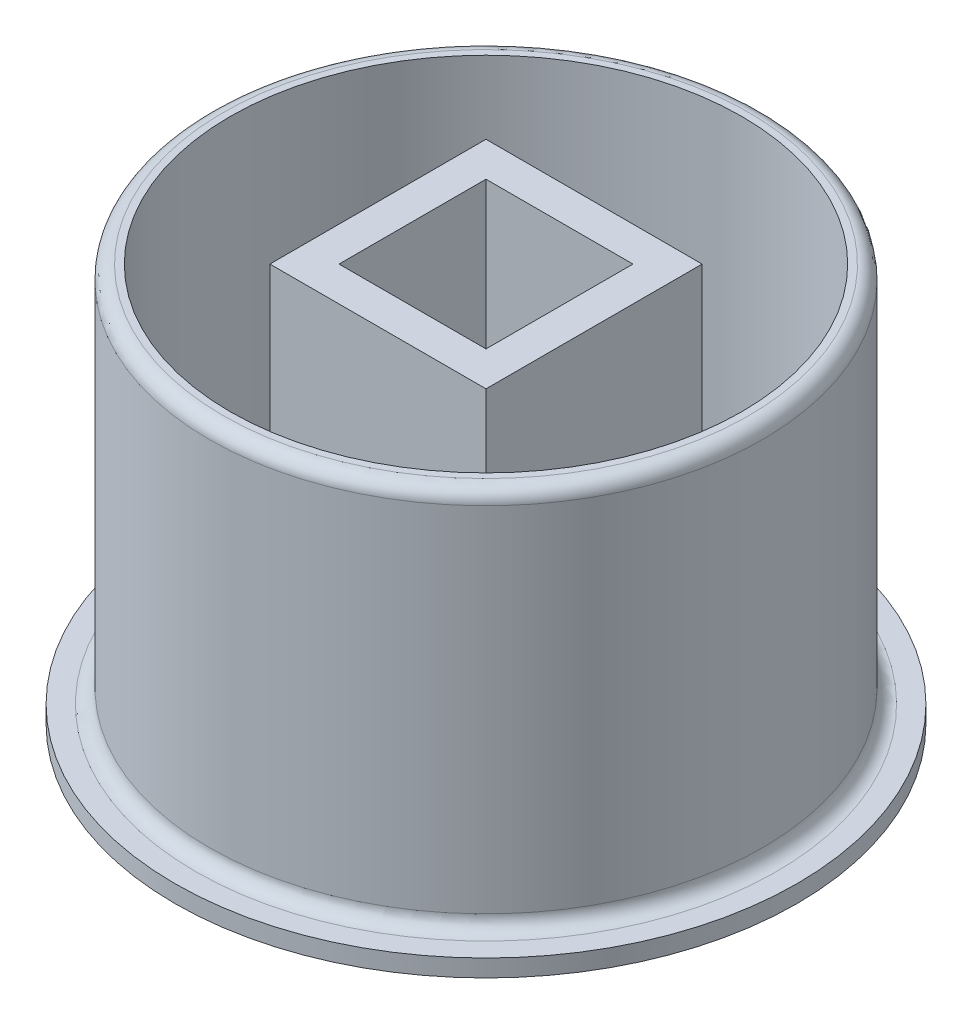
ISO-10303-21;
HEADER;
FILE_DESCRIPTION(('STEP AP214'),'2;1');
FILE_NAME('part.step','',(''),(''),'','','');
FILE_SCHEMA(('AUTOMOTIVE_DESIGN { 1 0 10303 214 1 1 1 1 }'));
ENDSEC;
DATA;
#1=APPLICATION_CONTEXT('core data for automotive mechanical design processes');
#2=APPLICATION_PROTOCOL_DEFINITION('international standard','automotive_design',2000,#1);
#3=PRODUCT_CONTEXT('',#1,'mechanical');
#4=PRODUCT('Part','Part','',(#3));
#5=PRODUCT_RELATED_PRODUCT_CATEGORY('part','',(#4));
#6=PRODUCT_DEFINITION_FORMATION('','',#4);
#7=PRODUCT_DEFINITION_CONTEXT('part definition',#1,'design');
#8=PRODUCT_DEFINITION('design','',#6,#7);
#9=PRODUCT_DEFINITION_SHAPE('','',#8);
#10=(LENGTH_UNIT() NAMED_UNIT(*) SI_UNIT(.MILLI.,.METRE.));
#11=(NAMED_UNIT(*) PLANE_ANGLE_UNIT() SI_UNIT($,.RADIAN.));
#12=(NAMED_UNIT(*) SI_UNIT($,.STERADIAN.) SOLID_ANGLE_UNIT());
#13=UNCERTAINTY_MEASURE_WITH_UNIT(LENGTH_MEASURE(1.E-05),#10,'distance_accuracy_value','');
#14=(GEOMETRIC_REPRESENTATION_CONTEXT(3) GLOBAL_UNCERTAINTY_ASSIGNED_CONTEXT((#13)) GLOBAL_UNIT_ASSIGNED_CONTEXT((#10,
#11,#12)) REPRESENTATION_CONTEXT('',''));
#15=CARTESIAN_POINT('',(0.,0.,0.));
#16=DIRECTION('',(0.,0.,1.));
#17=DIRECTION('',(1.,0.,0.));
#18=AXIS2_PLACEMENT_3D('',#15,#16,#17);
#19=CARTESIAN_POINT('',(0.,3.175,0.));
#20=DIRECTION('',(0.,-1.,0.));
#21=DIRECTION('',(0.,0.,-1.));
#22=AXIS2_PLACEMENT_3D('',#19,#20,#21);
#23=CYLINDRICAL_SURFACE('',#22,57.15);
#24=CARTESIAN_POINT('',(0.,3.175,0.));
#25=DIRECTION('',(0.,1.,0.));
#26=DIRECTION('',(0.,0.,1.));
#27=AXIS2_PLACEMENT_3D('',#24,#25,#26);
#28=CIRCLE('',#27,57.15);
#29=CARTESIAN_POINT('',(0.,3.175,57.15));
#30=VERTEX_POINT('',#29);
#31=EDGE_CURVE('E178',#30,#30,#28,.T.);
#32=ORIENTED_EDGE('',*,*,#31,.F.);
#33=EDGE_LOOP('',(#32));
#34=FACE_BOUND('',#33,.T.);
#35=CARTESIAN_POINT('',(0.,0.,0.));
#36=DIRECTION('',(0.,1.,0.));
#37=DIRECTION('',(0.,0.,1.));
#38=AXIS2_PLACEMENT_3D('',#35,#36,#37);
#39=CIRCLE('',#38,57.15);
#40=CARTESIAN_POINT('',(0.,0.,57.15));
#41=VERTEX_POINT('',#40);
#42=EDGE_CURVE('E177',#41,#41,#39,.T.);
#43=ORIENTED_EDGE('',*,*,#42,.T.);
#44=EDGE_LOOP('',(#43));
#45=FACE_BOUND('',#44,.T.);
#46=ADVANCED_FACE('F63',(#34,#45),#23,.T.);
#47=CARTESIAN_POINT('',(0.,3.175,0.));
#48=DIRECTION('',(0.,1.,0.));
#49=DIRECTION('',(0.,0.,1.));
#50=AXIS2_PLACEMENT_3D('',#47,#48,#49);
#51=PLANE('',#50);
#52=CARTESIAN_POINT('',(0.,3.175,0.));
#53=DIRECTION('',(0.,1.,0.));
#54=DIRECTION('',(0.,0.,1.));
#55=AXIS2_PLACEMENT_3D('',#52,#53,#54);
#56=CIRCLE('',#55,53.34);
#57=CARTESIAN_POINT('',(0.,3.175,53.34));
#58=VERTEX_POINT('',#57);
#59=EDGE_CURVE('E71',#58,#58,#56,.F.);
#60=ORIENTED_EDGE('',*,*,#59,.T.);
#61=EDGE_LOOP('',(#60));
#62=FACE_BOUND('',#61,.T.);
#63=ORIENTED_EDGE('',*,*,#31,.T.);
#64=EDGE_LOOP('',(#63));
#65=FACE_BOUND('',#64,.T.);
#66=ADVANCED_FACE('F191',(#62,#65),#51,.T.);
#67=CARTESIAN_POINT('',(0.,0.,0.));
#68=DIRECTION('',(0.,1.,0.));
#69=DIRECTION('',(0.,0.,1.));
#70=AXIS2_PLACEMENT_3D('',#67,#68,#69);
#71=PLANE('',#70);
#72=ORIENTED_EDGE('',*,*,#42,.F.);
#73=EDGE_LOOP('',(#72));
#74=FACE_BOUND('',#73,.T.);
#75=ADVANCED_FACE('F204',(#74),#71,.F.);
#76=CARTESIAN_POINT('',(0.,73.175,0.));
#77=DIRECTION('',(0.,-1.,0.));
#78=DIRECTION('',(0.,0.,-1.));
#79=AXIS2_PLACEMENT_3D('',#76,#77,#78);
#80=CYLINDRICAL_SURFACE('',#79,50.8);
#81=CARTESIAN_POINT('',(0.,5.715,0.));
#82=DIRECTION('',(0.,1.,0.));
#83=DIRECTION('',(0.,0.,1.));
#84=AXIS2_PLACEMENT_3D('',#81,#82,#83);
#85=CIRCLE('',#84,50.8);
#86=CARTESIAN_POINT('',(0.,5.715,50.8));
#87=VERTEX_POINT('',#86);
#88=EDGE_CURVE('E186',#87,#87,#85,.T.);
#89=ORIENTED_EDGE('',*,*,#88,.T.);
#90=EDGE_LOOP('',(#89));
#91=FACE_BOUND('',#90,.T.);
#92=CARTESIAN_POINT('',(0.,70.635,0.));
#93=DIRECTION('',(0.,1.,0.));
#94=DIRECTION('',(0.,0.,1.));
#95=AXIS2_PLACEMENT_3D('',#92,#93,#94);
#96=CIRCLE('',#95,50.8);
#97=CARTESIAN_POINT('',(0.,70.635,50.8));
#98=VERTEX_POINT('',#97);
#99=EDGE_CURVE('E181',#98,#98,#96,.F.);
#100=ORIENTED_EDGE('',*,*,#99,.T.);
#101=EDGE_LOOP('',(#100));
#102=FACE_BOUND('',#101,.T.);
#103=ADVANCED_FACE('F200',(#91,#102),#80,.T.);
#104=CARTESIAN_POINT('',(0.,73.175,0.));
#105=DIRECTION('',(0.,1.,0.));
#106=DIRECTION('',(0.,0.,1.));
#107=AXIS2_PLACEMENT_3D('',#104,#105,#106);
#108=PLANE('',#107);
#109=CARTESIAN_POINT('',(0.,73.175,0.));
#110=DIRECTION('',(0.,1.,0.));
#111=DIRECTION('',(0.,0.,1.));
#112=AXIS2_PLACEMENT_3D('',#109,#110,#111);
#113=CIRCLE('',#112,48.26);
#114=CARTESIAN_POINT('',(0.,73.175,48.26));
#115=VERTEX_POINT('',#114);
#116=EDGE_CURVE('E12',#115,#115,#113,.T.);
#117=ORIENTED_EDGE('',*,*,#116,.T.);
#118=EDGE_LOOP('',(#117));
#119=FACE_BOUND('',#118,.T.);
#120=CARTESIAN_POINT('',(0.,73.175,0.));
#121=DIRECTION('',(0.,1.,0.));
#122=DIRECTION('',(0.,0.,1.));
#123=AXIS2_PLACEMENT_3D('',#120,#121,#122);
#124=CIRCLE('',#123,46.99);
#125=CARTESIAN_POINT('',(0.,73.175,46.99));
#126=VERTEX_POINT('',#125);
#127=EDGE_CURVE('E167',#126,#126,#124,.T.);
#128=ORIENTED_EDGE('',*,*,#127,.F.);
#129=EDGE_LOOP('',(#128));
#130=FACE_BOUND('',#129,.T.);
#131=ADVANCED_FACE('F203',(#119,#130),#108,.T.);
#132=CARTESIAN_POINT('',(0.,3.81,0.));
#133=DIRECTION('',(0.,1.,0.));
#134=DIRECTION('',(0.,0.,1.));
#135=AXIS2_PLACEMENT_3D('',#132,#133,#134);
#136=PLANE('',#135);
#137=DIRECTION('',(1.,0.,0.));
#138=VECTOR('',#137,1.);
#139=CARTESIAN_POINT('',(-19.85,3.81,-19.85));
#140=LINE('',#139,#138);
#141=CARTESIAN_POINT('',(-19.85,3.81,-19.85));
#142=VERTEX_POINT('',#141);
#143=CARTESIAN_POINT('',(19.85,3.81,-19.85));
#144=VERTEX_POINT('',#143);
#145=EDGE_CURVE('E169',#142,#144,#140,.T.);
#146=ORIENTED_EDGE('',*,*,#145,.T.);
#147=DIRECTION('',(0.,0.,1.));
#148=VECTOR('',#147,1.);
#149=CARTESIAN_POINT('',(19.85,3.81,-19.85));
#150=LINE('',#149,#148);
#151=CARTESIAN_POINT('',(19.85,3.81,19.85));
#152=VERTEX_POINT('',#151);
#153=EDGE_CURVE('E159',#144,#152,#150,.T.);
#154=ORIENTED_EDGE('',*,*,#153,.T.);
#155=DIRECTION('',(-1.,0.,0.));
#156=VECTOR('',#155,1.);
#157=CARTESIAN_POINT('',(-19.85,3.81,19.85));
#158=LINE('',#157,#156);
#159=CARTESIAN_POINT('',(-19.85,3.81,19.85));
#160=VERTEX_POINT('',#159);
#161=EDGE_CURVE('E165',#152,#160,#158,.T.);
#162=ORIENTED_EDGE('',*,*,#161,.T.);
#163=DIRECTION('',(0.,0.,-1.));
#164=VECTOR('',#163,1.);
#165=CARTESIAN_POINT('',(-19.85,3.81,-19.85));
#166=LINE('',#165,#164);
#167=EDGE_CURVE('E86',#160,#142,#166,.T.);
#168=ORIENTED_EDGE('',*,*,#167,.T.);
#169=EDGE_LOOP('',(#146,#154,#162,#168));
#170=FACE_BOUND('',#169,.T.);
#171=CARTESIAN_POINT('',(0.,3.80999999999999,0.));
#172=DIRECTION('',(0.,1.,0.));
#173=DIRECTION('',(0.,0.,1.));
#174=AXIS2_PLACEMENT_3D('',#171,#172,#173);
#175=CIRCLE('',#174,46.99);
#176=CARTESIAN_POINT('',(0.,3.80999999999999,46.99));
#177=VERTEX_POINT('',#176);
#178=EDGE_CURVE('E174',#177,#177,#175,.F.);
#179=ORIENTED_EDGE('',*,*,#178,.F.);
#180=EDGE_LOOP('',(#179));
#181=FACE_BOUND('',#180,.T.);
#182=ADVANCED_FACE('F214',(#170,#181),#136,.T.);
#183=CARTESIAN_POINT('',(0.,73.175,0.));
#184=DIRECTION('',(0.,-1.,0.));
#185=DIRECTION('',(0.,0.,-1.));
#186=AXIS2_PLACEMENT_3D('',#183,#184,#185);
#187=CYLINDRICAL_SURFACE('',#186,46.99);
#188=ORIENTED_EDGE('',*,*,#178,.T.);
#189=EDGE_LOOP('',(#188));
#190=FACE_BOUND('',#189,.T.);
#191=ORIENTED_EDGE('',*,*,#127,.T.);
#192=EDGE_LOOP('',(#191));
#193=FACE_BOUND('',#192,.T.);
#194=ADVANCED_FACE('F218',(#190,#193),#187,.F.);
#195=CARTESIAN_POINT('',(-19.85,-0.002000000000002,-19.85));
#196=DIRECTION('',(0.,0.,-1.));
#197=DIRECTION('',(-1.,0.,0.));
#198=AXIS2_PLACEMENT_3D('',#195,#196,#197);
#199=PLANE('',#198);
#200=ORIENTED_EDGE('',*,*,#145,.F.);
#201=DIRECTION('',(0.,1.,0.));
#202=VECTOR('',#201,1.);
#203=CARTESIAN_POINT('',(-19.85,-0.002000000000002,-19.85));
#204=LINE('',#203,#202);
#205=CARTESIAN_POINT('',(-19.85,73.175,-19.85));
#206=VERTEX_POINT('',#205);
#207=EDGE_CURVE('E160',#142,#206,#204,.T.);
#208=ORIENTED_EDGE('',*,*,#207,.T.);
#209=DIRECTION('',(-1.,0.,0.));
#210=VECTOR('',#209,1.);
#211=CARTESIAN_POINT('',(-19.85,73.175,-19.85));
#212=LINE('',#211,#210);
#213=CARTESIAN_POINT('',(19.85,73.175,-19.85));
#214=VERTEX_POINT('',#213);
#215=EDGE_CURVE('E389',#214,#206,#212,.T.);
#216=ORIENTED_EDGE('',*,*,#215,.F.);
#217=DIRECTION('',(0.,1.,0.));
#218=VECTOR('',#217,1.);
#219=CARTESIAN_POINT('',(19.85,-0.002000000000002,-19.85));
#220=LINE('',#219,#218);
#221=EDGE_CURVE('E157',#144,#214,#220,.T.);
#222=ORIENTED_EDGE('',*,*,#221,.F.);
#223=EDGE_LOOP('',(#200,#208,#216,#222));
#224=FACE_BOUND('',#223,.T.);
#225=ADVANCED_FACE('F197',(#224),#199,.T.);
#226=CARTESIAN_POINT('',(-13.5,-0.002000000000002,13.5));
#227=DIRECTION('',(0.,0.,1.));
#228=DIRECTION('',(1.,0.,0.));
#229=AXIS2_PLACEMENT_3D('',#226,#227,#228);
#230=PLANE('',#229);
#231=DIRECTION('',(0.,1.,0.));
#232=VECTOR('',#231,1.);
#233=CARTESIAN_POINT('',(13.5,-0.002000000000002,13.5));
#234=LINE('',#233,#232);
#235=CARTESIAN_POINT('',(13.5,43.81,13.5));
#236=VERTEX_POINT('',#235);
#237=CARTESIAN_POINT('',(13.5,73.175,13.5));
#238=VERTEX_POINT('',#237);
#239=EDGE_CURVE('E149',#236,#238,#234,.T.);
#240=ORIENTED_EDGE('',*,*,#239,.F.);
#241=DIRECTION('',(1.,0.,0.));
#242=VECTOR('',#241,1.);
#243=CARTESIAN_POINT('',(-13.5,43.81,13.5));
#244=LINE('',#243,#242);
#245=CARTESIAN_POINT('',(-13.5,43.81,13.5));
#246=VERTEX_POINT('',#245);
#247=EDGE_CURVE('E141',#246,#236,#244,.T.);
#248=ORIENTED_EDGE('',*,*,#247,.F.);
#249=DIRECTION('',(0.,1.,0.));
#250=VECTOR('',#249,1.);
#251=CARTESIAN_POINT('',(-13.5,-0.002000000000002,13.5));
#252=LINE('',#251,#250);
#253=CARTESIAN_POINT('',(-13.5,73.175,13.5));
#254=VERTEX_POINT('',#253);
#255=EDGE_CURVE('E140',#246,#254,#252,.T.);
#256=ORIENTED_EDGE('',*,*,#255,.T.);
#257=DIRECTION('',(1.,0.,0.));
#258=VECTOR('',#257,1.);
#259=CARTESIAN_POINT('',(-13.5,73.175,13.5));
#260=LINE('',#259,#258);
#261=EDGE_CURVE('E380',#254,#238,#260,.T.);
#262=ORIENTED_EDGE('',*,*,#261,.T.);
#263=EDGE_LOOP('',(#240,#248,#256,#262));
#264=FACE_BOUND('',#263,.T.);
#265=ADVANCED_FACE('F226',(#264),#230,.F.);
#266=CARTESIAN_POINT('',(-19.85,-0.002000000000002,-19.85));
#267=DIRECTION('',(-1.,0.,0.));
#268=DIRECTION('',(0.,0.,1.));
#269=AXIS2_PLACEMENT_3D('',#266,#267,#268);
#270=PLANE('',#269);
#271=ORIENTED_EDGE('',*,*,#167,.F.);
#272=DIRECTION('',(0.,1.,0.));
#273=VECTOR('',#272,1.);
#274=CARTESIAN_POINT('',(-19.85,-0.002000000000002,19.85));
#275=LINE('',#274,#273);
#276=CARTESIAN_POINT('',(-19.85,73.175,19.85));
#277=VERTEX_POINT('',#276);
#278=EDGE_CURVE('E162',#160,#277,#275,.T.);
#279=ORIENTED_EDGE('',*,*,#278,.T.);
#280=DIRECTION('',(0.,0.,1.));
#281=VECTOR('',#280,1.);
#282=CARTESIAN_POINT('',(-19.85,73.175,-19.85));
#283=LINE('',#282,#281);
#284=EDGE_CURVE('E396',#206,#277,#283,.T.);
#285=ORIENTED_EDGE('',*,*,#284,.F.);
#286=ORIENTED_EDGE('',*,*,#207,.F.);
#287=EDGE_LOOP('',(#271,#279,#285,#286));
#288=FACE_BOUND('',#287,.T.);
#289=ADVANCED_FACE('F277',(#288),#270,.T.);
#290=CARTESIAN_POINT('',(0.,73.175,0.));
#291=DIRECTION('',(0.,1.,0.));
#292=DIRECTION('',(0.,0.,1.));
#293=AXIS2_PLACEMENT_3D('',#290,#291,#292);
#294=PLANE('',#293);
#295=DIRECTION('',(0.,0.,-1.));
#296=VECTOR('',#295,1.);
#297=CARTESIAN_POINT('',(13.5,73.175,-13.5));
#298=LINE('',#297,#296);
#299=CARTESIAN_POINT('',(13.5,73.175,-13.5));
#300=VERTEX_POINT('',#299);
#301=EDGE_CURVE('E151',#238,#300,#298,.T.);
#302=ORIENTED_EDGE('',*,*,#301,.F.);
#303=ORIENTED_EDGE('',*,*,#261,.F.);
#304=DIRECTION('',(0.,0.,1.));
#305=VECTOR('',#304,1.);
#306=CARTESIAN_POINT('',(-13.5,73.175,-13.5));
#307=LINE('',#306,#305);
#308=CARTESIAN_POINT('',(-13.5,73.175,-13.5));
#309=VERTEX_POINT('',#308);
#310=EDGE_CURVE('E388',#309,#254,#307,.T.);
#311=ORIENTED_EDGE('',*,*,#310,.F.);
#312=DIRECTION('',(-1.,0.,0.));
#313=VECTOR('',#312,1.);
#314=CARTESIAN_POINT('',(-13.5,73.175,-13.5));
#315=LINE('',#314,#313);
#316=EDGE_CURVE('E145',#300,#309,#315,.T.);
#317=ORIENTED_EDGE('',*,*,#316,.F.);
#318=EDGE_LOOP('',(#302,#303,#311,#317));
#319=FACE_BOUND('',#318,.T.);
#320=DIRECTION('',(0.,0.,-1.));
#321=VECTOR('',#320,1.);
#322=CARTESIAN_POINT('',(19.85,73.175,-19.85));
#323=LINE('',#322,#321);
#324=CARTESIAN_POINT('',(19.85,73.175,19.85));
#325=VERTEX_POINT('',#324);
#326=EDGE_CURVE('E386',#325,#214,#323,.T.);
#327=ORIENTED_EDGE('',*,*,#326,.T.);
#328=ORIENTED_EDGE('',*,*,#215,.T.);
#329=ORIENTED_EDGE('',*,*,#284,.T.);
#330=DIRECTION('',(1.,0.,0.));
#331=VECTOR('',#330,1.);
#332=CARTESIAN_POINT('',(-19.85,73.175,19.85));
#333=LINE('',#332,#331);
#334=EDGE_CURVE('E393',#277,#325,#333,.T.);
#335=ORIENTED_EDGE('',*,*,#334,.T.);
#336=EDGE_LOOP('',(#327,#328,#329,#335));
#337=FACE_BOUND('',#336,.T.);
#338=ADVANCED_FACE('F282',(#319,#337),#294,.T.);
#339=CARTESIAN_POINT('',(19.85,-0.002000000000002,-19.85));
#340=DIRECTION('',(1.,0.,0.));
#341=DIRECTION('',(0.,0.,-1.));
#342=AXIS2_PLACEMENT_3D('',#339,#340,#341);
#343=PLANE('',#342);
#344=ORIENTED_EDGE('',*,*,#153,.F.);
#345=ORIENTED_EDGE('',*,*,#221,.T.);
#346=ORIENTED_EDGE('',*,*,#326,.F.);
#347=DIRECTION('',(0.,1.,0.));
#348=VECTOR('',#347,1.);
#349=CARTESIAN_POINT('',(19.85,-0.002000000000002,19.85));
#350=LINE('',#349,#348);
#351=EDGE_CURVE('E155',#152,#325,#350,.T.);
#352=ORIENTED_EDGE('',*,*,#351,.F.);
#353=EDGE_LOOP('',(#344,#345,#346,#352));
#354=FACE_BOUND('',#353,.T.);
#355=ADVANCED_FACE('F292',(#354),#343,.T.);
#356=CARTESIAN_POINT('',(-19.85,-0.002000000000002,19.85));
#357=DIRECTION('',(0.,0.,1.));
#358=DIRECTION('',(1.,0.,0.));
#359=AXIS2_PLACEMENT_3D('',#356,#357,#358);
#360=PLANE('',#359);
#361=ORIENTED_EDGE('',*,*,#161,.F.);
#362=ORIENTED_EDGE('',*,*,#351,.T.);
#363=ORIENTED_EDGE('',*,*,#334,.F.);
#364=ORIENTED_EDGE('',*,*,#278,.F.);
#365=EDGE_LOOP('',(#361,#362,#363,#364));
#366=FACE_BOUND('',#365,.T.);
#367=ADVANCED_FACE('F302',(#366),#360,.T.);
#368=CARTESIAN_POINT('',(13.5,-0.002000000000002,-13.5));
#369=DIRECTION('',(1.,0.,0.));
#370=DIRECTION('',(0.,0.,-1.));
#371=AXIS2_PLACEMENT_3D('',#368,#369,#370);
#372=PLANE('',#371);
#373=DIRECTION('',(0.,1.,0.));
#374=VECTOR('',#373,1.);
#375=CARTESIAN_POINT('',(13.5,-0.002000000000002,-13.5));
#376=LINE('',#375,#374);
#377=CARTESIAN_POINT('',(13.5,43.81,-13.5));
#378=VERTEX_POINT('',#377);
#379=EDGE_CURVE('E147',#378,#300,#376,.T.);
#380=ORIENTED_EDGE('',*,*,#379,.F.);
#381=DIRECTION('',(0.,0.,-1.));
#382=VECTOR('',#381,1.);
#383=CARTESIAN_POINT('',(13.5,43.81,-13.5));
#384=LINE('',#383,#382);
#385=EDGE_CURVE('E78',#236,#378,#384,.T.);
#386=ORIENTED_EDGE('',*,*,#385,.F.);
#387=ORIENTED_EDGE('',*,*,#239,.T.);
#388=ORIENTED_EDGE('',*,*,#301,.T.);
#389=EDGE_LOOP('',(#380,#386,#387,#388));
#390=FACE_BOUND('',#389,.T.);
#391=ADVANCED_FACE('F311',(#390),#372,.F.);
#392=CARTESIAN_POINT('',(-13.5,-0.002000000000002,-13.5));
#393=DIRECTION('',(-1.,0.,0.));
#394=DIRECTION('',(0.,0.,1.));
#395=AXIS2_PLACEMENT_3D('',#392,#393,#394);
#396=PLANE('',#395);
#397=ORIENTED_EDGE('',*,*,#255,.F.);
#398=DIRECTION('',(0.,0.,1.));
#399=VECTOR('',#398,1.);
#400=CARTESIAN_POINT('',(-13.5,43.81,-13.5));
#401=LINE('',#400,#399);
#402=CARTESIAN_POINT('',(-13.5,43.81,-13.5));
#403=VERTEX_POINT('',#402);
#404=EDGE_CURVE('E128',#403,#246,#401,.T.);
#405=ORIENTED_EDGE('',*,*,#404,.F.);
#406=DIRECTION('',(0.,1.,0.));
#407=VECTOR('',#406,1.);
#408=CARTESIAN_POINT('',(-13.5,-0.002000000000002,-13.5));
#409=LINE('',#408,#407);
#410=EDGE_CURVE('E138',#403,#309,#409,.T.);
#411=ORIENTED_EDGE('',*,*,#410,.T.);
#412=ORIENTED_EDGE('',*,*,#310,.T.);
#413=EDGE_LOOP('',(#397,#405,#411,#412));
#414=FACE_BOUND('',#413,.T.);
#415=ADVANCED_FACE('F136',(#414),#396,.F.);
#416=CARTESIAN_POINT('',(-13.5,-0.002000000000002,-13.5));
#417=DIRECTION('',(0.,0.,-1.));
#418=DIRECTION('',(-1.,0.,0.));
#419=AXIS2_PLACEMENT_3D('',#416,#417,#418);
#420=PLANE('',#419);
#421=ORIENTED_EDGE('',*,*,#410,.F.);
#422=DIRECTION('',(-1.,0.,0.));
#423=VECTOR('',#422,1.);
#424=CARTESIAN_POINT('',(-13.5,43.81,-13.5));
#425=LINE('',#424,#423);
#426=EDGE_CURVE('E125',#378,#403,#425,.T.);
#427=ORIENTED_EDGE('',*,*,#426,.F.);
#428=ORIENTED_EDGE('',*,*,#379,.T.);
#429=ORIENTED_EDGE('',*,*,#316,.T.);
#430=EDGE_LOOP('',(#421,#427,#428,#429));
#431=FACE_BOUND('',#430,.T.);
#432=ADVANCED_FACE('F143',(#431),#420,.F.);
#433=CARTESIAN_POINT('',(0.,5.715,0.));
#434=DIRECTION('',(0.,1.,0.));
#435=DIRECTION('',(0.,0.,1.));
#436=AXIS2_PLACEMENT_3D('',#433,#434,#435);
#437=TOROIDAL_SURFACE('',#436,53.34,2.54);
#438=ORIENTED_EDGE('',*,*,#59,.F.);
#439=EDGE_LOOP('',(#438));
#440=FACE_BOUND('',#439,.T.);
#441=ORIENTED_EDGE('',*,*,#88,.F.);
#442=EDGE_LOOP('',(#441));
#443=FACE_BOUND('',#442,.T.);
#444=ADVANCED_FACE('F194',(#440,#443),#437,.F.);
#445=CARTESIAN_POINT('',(0.,70.635,0.));
#446=DIRECTION('',(0.,1.,0.));
#447=DIRECTION('',(0.,0.,1.));
#448=AXIS2_PLACEMENT_3D('',#445,#446,#447);
#449=TOROIDAL_SURFACE('',#448,48.26,2.54);
#450=ORIENTED_EDGE('',*,*,#99,.F.);
#451=EDGE_LOOP('',(#450));
#452=FACE_BOUND('',#451,.T.);
#453=ORIENTED_EDGE('',*,*,#116,.F.);
#454=EDGE_LOOP('',(#453));
#455=FACE_BOUND('',#454,.T.);
#456=ADVANCED_FACE('F65',(#452,#455),#449,.T.);
#457=CARTESIAN_POINT('',(0.,43.81,0.));
#458=DIRECTION('',(0.,1.,0.));
#459=DIRECTION('',(0.,0.,1.));
#460=AXIS2_PLACEMENT_3D('',#457,#458,#459);
#461=PLANE('',#460);
#462=ORIENTED_EDGE('',*,*,#385,.T.);
#463=ORIENTED_EDGE('',*,*,#426,.T.);
#464=ORIENTED_EDGE('',*,*,#404,.T.);
#465=ORIENTED_EDGE('',*,*,#247,.T.);
#466=EDGE_LOOP('',(#462,#463,#464,#465));
#467=FACE_BOUND('',#466,.T.);
#468=ADVANCED_FACE('F127',(#467),#461,.T.);
#469=CLOSED_SHELL('',(#46,#66,#75,#103,#131,#182,#194,#225,#265,#289,#338,#355,#367,#391,#415,
#432,#444,#456,#468));
#470=MANIFOLD_SOLID_BREP('B2',#469);
#471=ADVANCED_BREP_SHAPE_REPRESENTATION('',(#18,#470),#14);
#472=SHAPE_DEFINITION_REPRESENTATION(#9,#471);
ENDSEC;
END-ISO-10303-21;
